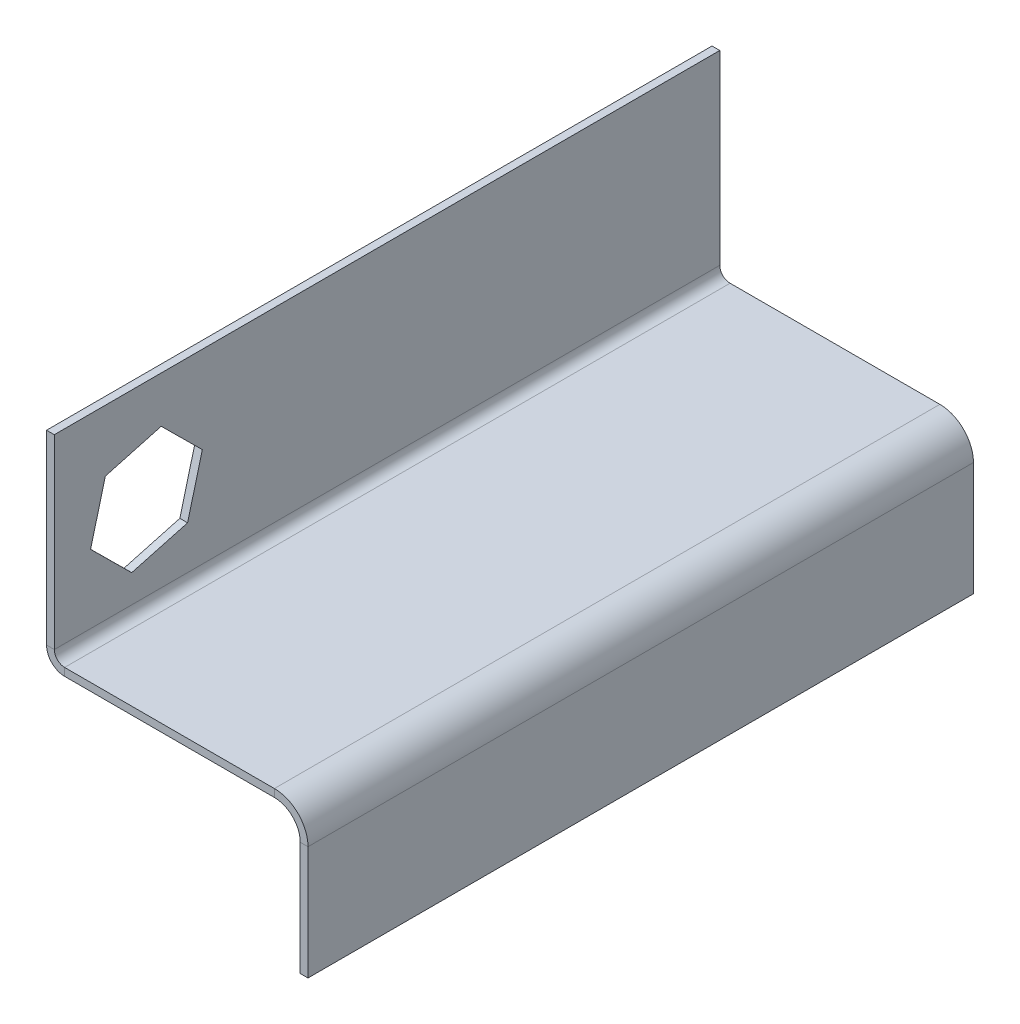
ISO-10303-21;
HEADER;
FILE_DESCRIPTION(('STEP AP214'),'2;1');
FILE_NAME('part.step','',(''),(''),'','','');
FILE_SCHEMA(('AUTOMOTIVE_DESIGN { 1 0 10303 214 1 1 1 1 }'));
ENDSEC;
DATA;
#1=APPLICATION_CONTEXT('core data for automotive mechanical design processes');
#2=APPLICATION_PROTOCOL_DEFINITION('international standard','automotive_design',2000,#1);
#3=PRODUCT_CONTEXT('',#1,'mechanical');
#4=PRODUCT('Part','Part','',(#3));
#5=PRODUCT_RELATED_PRODUCT_CATEGORY('part','',(#4));
#6=PRODUCT_DEFINITION_FORMATION('','',#4);
#7=PRODUCT_DEFINITION_CONTEXT('part definition',#1,'design');
#8=PRODUCT_DEFINITION('design','',#6,#7);
#9=PRODUCT_DEFINITION_SHAPE('','',#8);
#10=(LENGTH_UNIT() NAMED_UNIT(*) SI_UNIT(.MILLI.,.METRE.));
#11=(NAMED_UNIT(*) PLANE_ANGLE_UNIT() SI_UNIT($,.RADIAN.));
#12=(NAMED_UNIT(*) SI_UNIT($,.STERADIAN.) SOLID_ANGLE_UNIT());
#13=UNCERTAINTY_MEASURE_WITH_UNIT(LENGTH_MEASURE(1.E-05),#10,'distance_accuracy_value','');
#14=(GEOMETRIC_REPRESENTATION_CONTEXT(3) GLOBAL_UNCERTAINTY_ASSIGNED_CONTEXT((#13)) GLOBAL_UNIT_ASSIGNED_CONTEXT((#10,
#11,#12)) REPRESENTATION_CONTEXT('',''));
#15=CARTESIAN_POINT('',(0.,0.,0.));
#16=DIRECTION('',(0.,0.,1.));
#17=DIRECTION('',(1.,0.,0.));
#18=AXIS2_PLACEMENT_3D('',#15,#16,#17);
#19=CARTESIAN_POINT('',(-56.8403893475499,-26.7393226378745,257.539224291611));
#20=DIRECTION('',(0.,0.,1.));
#21=DIRECTION('',(1.,0.,0.));
#22=AXIS2_PLACEMENT_3D('',#19,#20,#21);
#23=PLANE('',#22);
#24=DIRECTION('',(1.,0.,0.));
#25=VECTOR('',#24,1.);
#26=CARTESIAN_POINT('',(-53.8403893475499,-33.7393226378745,257.539224291611));
#27=LINE('',#26,#25);
#28=CARTESIAN_POINT('',(-49.8403893475499,-33.7393226378745,257.539224291611));
#29=VERTEX_POINT('',#28);
#30=CARTESIAN_POINT('',(31.3391441685706,-33.7393226378745,257.539224291611));
#31=VERTEX_POINT('',#30);
#32=EDGE_CURVE('E280',#29,#31,#27,.T.);
#33=ORIENTED_EDGE('',*,*,#32,.T.);
#34=DIRECTION('',(0.,1.,0.));
#35=VECTOR('',#34,1.);
#36=CARTESIAN_POINT('',(31.3391441685706,-33.7393226378745,257.539224291611));
#37=LINE('',#36,#35);
#38=CARTESIAN_POINT('',(31.3391441685706,-30.7393226378745,257.539224291611));
#39=VERTEX_POINT('',#38);
#40=EDGE_CURVE('E242',#31,#39,#37,.T.);
#41=ORIENTED_EDGE('',*,*,#40,.T.);
#42=DIRECTION('',(1.,0.,0.));
#43=VECTOR('',#42,1.);
#44=CARTESIAN_POINT('',(-53.8403893475499,-30.7393226378745,257.539224291611));
#45=LINE('',#44,#43);
#46=CARTESIAN_POINT('',(-49.8403893475499,-30.7393226378745,257.539224291611));
#47=VERTEX_POINT('',#46);
#48=EDGE_CURVE('E283',#47,#39,#45,.T.);
#49=ORIENTED_EDGE('',*,*,#48,.F.);
#50=DIRECTION('',(0.,-1.,0.));
#51=VECTOR('',#50,1.);
#52=CARTESIAN_POINT('',(-49.8403893475499,-30.7393226378745,257.539224291611));
#53=LINE('',#52,#51);
#54=EDGE_CURVE('E343',#47,#29,#53,.T.);
#55=ORIENTED_EDGE('',*,*,#54,.T.);
#56=EDGE_LOOP('',(#33,#41,#49,#55));
#57=FACE_BOUND('',#56,.T.);
#58=ADVANCED_FACE('F60',(#57),#23,.T.);
#59=CARTESIAN_POINT('',(-53.8403893475499,-33.7393226378745,257.539224291611));
#60=DIRECTION('',(0.,1.,0.));
#61=DIRECTION('',(0.,0.,1.));
#62=AXIS2_PLACEMENT_3D('',#59,#60,#61);
#63=PLANE('',#62);
#64=DIRECTION('',(0.,0.,1.));
#65=VECTOR('',#64,1.);
#66=CARTESIAN_POINT('',(31.3391441685706,-33.7393226378745,257.539224291611));
#67=LINE('',#66,#65);
#68=CARTESIAN_POINT('',(31.3391441685706,-33.7393226378745,0.));
#69=VERTEX_POINT('',#68);
#70=EDGE_CURVE('E246',#31,#69,#67,.F.);
#71=ORIENTED_EDGE('',*,*,#70,.F.);
#72=ORIENTED_EDGE('',*,*,#32,.F.);
#73=DIRECTION('',(0.,0.,-1.));
#74=VECTOR('',#73,1.);
#75=CARTESIAN_POINT('',(-49.8403893475499,-33.7393226378745,257.539224291611));
#76=LINE('',#75,#74);
#77=CARTESIAN_POINT('',(-49.8403893475499,-33.7393226378745,0.));
#78=VERTEX_POINT('',#77);
#79=EDGE_CURVE('E302',#29,#78,#76,.T.);
#80=ORIENTED_EDGE('',*,*,#79,.T.);
#81=DIRECTION('',(1.,0.,0.));
#82=VECTOR('',#81,1.);
#83=CARTESIAN_POINT('',(-53.8403893475499,-33.7393226378745,0.));
#84=LINE('',#83,#82);
#85=EDGE_CURVE('E271',#78,#69,#84,.T.);
#86=ORIENTED_EDGE('',*,*,#85,.T.);
#87=EDGE_LOOP('',(#71,#72,#80,#86));
#88=FACE_BOUND('',#87,.T.);
#89=ADVANCED_FACE('F391',(#88),#63,.F.);
#90=CARTESIAN_POINT('',(-53.8403893475499,-30.7393226378745,257.539224291611));
#91=DIRECTION('',(0.,1.,0.));
#92=DIRECTION('',(0.,0.,1.));
#93=AXIS2_PLACEMENT_3D('',#90,#91,#92);
#94=PLANE('',#93);
#95=ORIENTED_EDGE('',*,*,#48,.T.);
#96=DIRECTION('',(0.,0.,1.));
#97=VECTOR('',#96,1.);
#98=CARTESIAN_POINT('',(31.3391441685706,-30.7393226378745,257.539224291611));
#99=LINE('',#98,#97);
#100=CARTESIAN_POINT('',(31.3391441685706,-30.7393226378745,0.));
#101=VERTEX_POINT('',#100);
#102=EDGE_CURVE('E192',#39,#101,#99,.F.);
#103=ORIENTED_EDGE('',*,*,#102,.T.);
#104=DIRECTION('',(1.,0.,0.));
#105=VECTOR('',#104,1.);
#106=CARTESIAN_POINT('',(-53.8403893475499,-30.7393226378745,0.));
#107=LINE('',#106,#105);
#108=CARTESIAN_POINT('',(-49.8403893475499,-30.7393226378745,0.));
#109=VERTEX_POINT('',#108);
#110=EDGE_CURVE('E305',#109,#101,#107,.T.);
#111=ORIENTED_EDGE('',*,*,#110,.F.);
#112=DIRECTION('',(0.,0.,-1.));
#113=VECTOR('',#112,1.);
#114=CARTESIAN_POINT('',(-49.8403893475499,-30.7393226378745,257.539224291611));
#115=LINE('',#114,#113);
#116=EDGE_CURVE('E334',#47,#109,#115,.T.);
#117=ORIENTED_EDGE('',*,*,#116,.F.);
#118=EDGE_LOOP('',(#95,#103,#111,#117));
#119=FACE_BOUND('',#118,.T.);
#120=ADVANCED_FACE('F396',(#119),#94,.T.);
#121=CARTESIAN_POINT('',(-49.8403893475499,-30.7393226378745,257.539224291611));
#122=DIRECTION('',(0.,0.,1.));
#123=DIRECTION('',(1.,0.,0.));
#124=AXIS2_PLACEMENT_3D('',#121,#122,#123);
#125=PLANE('',#124);
#126=ORIENTED_EDGE('',*,*,#54,.F.);
#127=CARTESIAN_POINT('',(-49.8403893475499,-26.7393226378745,257.539224291611));
#128=DIRECTION('',(0.,0.,-1.));
#129=DIRECTION('',(-1.,0.,0.));
#130=AXIS2_PLACEMENT_3D('',#127,#128,#129);
#131=CIRCLE('',#130,4.);
#132=CARTESIAN_POINT('',(-53.8403893475499,-26.7393226378745,257.539224291611));
#133=VERTEX_POINT('',#132);
#134=EDGE_CURVE('E287',#133,#47,#131,.F.);
#135=ORIENTED_EDGE('',*,*,#134,.F.);
#136=DIRECTION('',(1.,0.,0.));
#137=VECTOR('',#136,1.);
#138=CARTESIAN_POINT('',(-56.8403893475499,-26.7393226378745,257.539224291611));
#139=LINE('',#138,#137);
#140=CARTESIAN_POINT('',(-56.8403893475499,-26.7393226378745,257.539224291611));
#141=VERTEX_POINT('',#140);
#142=EDGE_CURVE('E341',#141,#133,#139,.T.);
#143=ORIENTED_EDGE('',*,*,#142,.F.);
#144=CARTESIAN_POINT('',(-49.8403893475499,-26.7393226378745,257.539224291611));
#145=DIRECTION('',(0.,0.,1.));
#146=DIRECTION('',(1.,0.,0.));
#147=AXIS2_PLACEMENT_3D('',#144,#145,#146);
#148=CIRCLE('',#147,7.);
#149=EDGE_CURVE('E299',#141,#29,#148,.T.);
#150=ORIENTED_EDGE('',*,*,#149,.T.);
#151=EDGE_LOOP('',(#126,#135,#143,#150));
#152=FACE_BOUND('',#151,.T.);
#153=ADVANCED_FACE('F62',(#152),#125,.T.);
#154=CARTESIAN_POINT('',(-53.8403893475499,-26.7393226378745,0.));
#155=DIRECTION('',(0.,0.,-1.));
#156=DIRECTION('',(-1.,0.,0.));
#157=AXIS2_PLACEMENT_3D('',#154,#155,#156);
#158=PLANE('',#157);
#159=DIRECTION('',(-1.,0.,0.));
#160=VECTOR('',#159,1.);
#161=CARTESIAN_POINT('',(-53.8403893475499,-26.7393226378745,0.));
#162=LINE('',#161,#160);
#163=CARTESIAN_POINT('',(-53.8403893475499,-26.7393226378745,0.));
#164=VERTEX_POINT('',#163);
#165=CARTESIAN_POINT('',(-56.8403893475499,-26.7393226378745,0.));
#166=VERTEX_POINT('',#165);
#167=EDGE_CURVE('E339',#164,#166,#162,.T.);
#168=ORIENTED_EDGE('',*,*,#167,.F.);
#169=CARTESIAN_POINT('',(-49.8403893475499,-26.7393226378745,0.));
#170=DIRECTION('',(0.,0.,-1.));
#171=DIRECTION('',(-1.,0.,0.));
#172=AXIS2_PLACEMENT_3D('',#169,#170,#171);
#173=CIRCLE('',#172,4.);
#174=EDGE_CURVE('E308',#164,#109,#173,.F.);
#175=ORIENTED_EDGE('',*,*,#174,.T.);
#176=DIRECTION('',(0.,1.,0.));
#177=VECTOR('',#176,1.);
#178=CARTESIAN_POINT('',(-49.8403893475499,-33.7393226378745,0.));
#179=LINE('',#178,#177);
#180=EDGE_CURVE('E337',#78,#109,#179,.T.);
#181=ORIENTED_EDGE('',*,*,#180,.F.);
#182=CARTESIAN_POINT('',(-49.8403893475499,-26.7393226378745,0.));
#183=DIRECTION('',(0.,0.,1.));
#184=DIRECTION('',(1.,0.,0.));
#185=AXIS2_PLACEMENT_3D('',#182,#183,#184);
#186=CIRCLE('',#185,7.);
#187=EDGE_CURVE('E284',#166,#78,#186,.T.);
#188=ORIENTED_EDGE('',*,*,#187,.F.);
#189=EDGE_LOOP('',(#168,#175,#181,#188));
#190=FACE_BOUND('',#189,.T.);
#191=ADVANCED_FACE('F400',(#190),#158,.T.);
#192=CARTESIAN_POINT('',(-49.8403893475499,-33.7393226378745,0.));
#193=DIRECTION('',(0.,0.,-1.));
#194=DIRECTION('',(-1.,0.,0.));
#195=AXIS2_PLACEMENT_3D('',#192,#193,#194);
#196=PLANE('',#195);
#197=DIRECTION('',(0.,-1.,0.));
#198=VECTOR('',#197,1.);
#199=CARTESIAN_POINT('',(-53.8403893475499,45.2706387939607,0.));
#200=LINE('',#199,#198);
#201=CARTESIAN_POINT('',(-53.8403893475499,45.2706387939607,0.));
#202=VERTEX_POINT('',#201);
#203=EDGE_CURVE('E311',#202,#164,#200,.T.);
#204=ORIENTED_EDGE('',*,*,#203,.T.);
#205=ORIENTED_EDGE('',*,*,#167,.T.);
#206=DIRECTION('',(0.,1.,0.));
#207=VECTOR('',#206,1.);
#208=CARTESIAN_POINT('',(-56.8403893475499,45.2706387939607,0.));
#209=LINE('',#208,#207);
#210=CARTESIAN_POINT('',(-56.8403893475499,45.2706387939607,0.));
#211=VERTEX_POINT('',#210);
#212=EDGE_CURVE('E317',#211,#166,#209,.F.);
#213=ORIENTED_EDGE('',*,*,#212,.F.);
#214=DIRECTION('',(1.,0.,0.));
#215=VECTOR('',#214,1.);
#216=CARTESIAN_POINT('',(-56.8403893475499,45.2706387939607,0.));
#217=LINE('',#216,#215);
#218=EDGE_CURVE('E314',#211,#202,#217,.T.);
#219=ORIENTED_EDGE('',*,*,#218,.T.);
#220=EDGE_LOOP('',(#204,#205,#213,#219));
#221=FACE_BOUND('',#220,.T.);
#222=ADVANCED_FACE('F403',(#221),#196,.T.);
#223=CARTESIAN_POINT('',(-49.8403893475499,-26.7393226378745,257.539224291611));
#224=DIRECTION('',(0.,0.,-1.));
#225=DIRECTION('',(-1.,0.,0.));
#226=AXIS2_PLACEMENT_3D('',#223,#224,#225);
#227=CYLINDRICAL_SURFACE('',#226,4.);
#228=ORIENTED_EDGE('',*,*,#174,.F.);
#229=DIRECTION('',(0.,0.,-1.));
#230=VECTOR('',#229,1.);
#231=CARTESIAN_POINT('',(-53.8403893475499,-26.7393226378745,257.539224291611));
#232=LINE('',#231,#230);
#233=EDGE_CURVE('E331',#133,#164,#232,.T.);
#234=ORIENTED_EDGE('',*,*,#233,.F.);
#235=ORIENTED_EDGE('',*,*,#134,.T.);
#236=ORIENTED_EDGE('',*,*,#116,.T.);
#237=EDGE_LOOP('',(#228,#234,#235,#236));
#238=FACE_BOUND('',#237,.T.);
#239=ADVANCED_FACE('F406',(#238),#227,.F.);
#240=CARTESIAN_POINT('',(-53.8403893475499,45.2706387939607,257.539224291611));
#241=DIRECTION('',(1.,0.,0.));
#242=DIRECTION('',(0.,0.,-1.));
#243=AXIS2_PLACEMENT_3D('',#240,#241,#242);
#244=PLANE('',#243);
#245=DIRECTION('',(0.,0.704077392377449,0.710123246727616));
#246=VECTOR('',#245,1.);
#247=CARTESIAN_POINT('',(-53.8403893475499,11.6094138400761,200.245910723487));
#248=LINE('',#247,#246);
#249=CARTESIAN_POINT('',(-53.8403893475499,11.6094138400761,200.245910723487));
#250=VERTEX_POINT('',#249);
#251=CARTESIAN_POINT('',(-53.8403893475499,27.3905891493059,216.162597680196));
#252=VERTEX_POINT('',#251);
#253=EDGE_CURVE('E75',#250,#252,#248,.T.);
#254=ORIENTED_EDGE('',*,*,#253,.F.);
#255=DIRECTION('',(0.,0.967023467672726,-0.254687284665366));
#256=VECTOR('',#255,1.);
#257=CARTESIAN_POINT('',(-53.8403893475499,-10.0654290631334,205.954465964501));
#258=LINE('',#257,#256);
#259=CARTESIAN_POINT('',(-53.8403893475499,-10.0654290631334,205.954465964501));
#260=VERTEX_POINT('',#259);
#261=EDGE_CURVE('E265',#260,#250,#258,.T.);
#262=ORIENTED_EDGE('',*,*,#261,.F.);
#263=DIRECTION('',(0.,0.262946075295278,-0.964810531392983));
#264=VECTOR('',#263,1.);
#265=CARTESIAN_POINT('',(-53.8403893475499,-15.9590966571131,227.579708162224));
#266=LINE('',#265,#264);
#267=CARTESIAN_POINT('',(-53.8403893475499,-15.9590966571131,227.579708162224));
#268=VERTEX_POINT('',#267);
#269=EDGE_CURVE('E262',#268,#260,#266,.T.);
#270=ORIENTED_EDGE('',*,*,#269,.F.);
#271=DIRECTION('',(0.,-0.704077392377448,-0.710123246727617));
#272=VECTOR('',#271,1.);
#273=CARTESIAN_POINT('',(-53.8403893475499,-0.177921347883333,243.496395118933));
#274=LINE('',#273,#272);
#275=CARTESIAN_POINT('',(-53.8403893475499,-0.177921347883333,243.496395118933));
#276=VERTEX_POINT('',#275);
#277=EDGE_CURVE('E259',#276,#268,#274,.T.);
#278=ORIENTED_EDGE('',*,*,#277,.F.);
#279=DIRECTION('',(0.,-0.967023467672726,0.254687284665365));
#280=VECTOR('',#279,1.);
#281=CARTESIAN_POINT('',(-53.8403893475499,21.4969215553262,237.787839877919));
#282=LINE('',#281,#280);
#283=CARTESIAN_POINT('',(-53.8403893475499,21.4969215553262,237.787839877919));
#284=VERTEX_POINT('',#283);
#285=EDGE_CURVE('E256',#284,#276,#282,.T.);
#286=ORIENTED_EDGE('',*,*,#285,.F.);
#287=DIRECTION('',(0.,-0.262946075295276,0.964810531392983));
#288=VECTOR('',#287,1.);
#289=CARTESIAN_POINT('',(-53.8403893475499,27.3905891493059,216.162597680196));
#290=LINE('',#289,#288);
#291=EDGE_CURVE('E254',#252,#284,#290,.T.);
#292=ORIENTED_EDGE('',*,*,#291,.F.);
#293=EDGE_LOOP('',(#254,#262,#270,#278,#286,#292));
#294=FACE_BOUND('',#293,.T.);
#295=ORIENTED_EDGE('',*,*,#203,.F.);
#296=DIRECTION('',(0.,0.,-1.));
#297=VECTOR('',#296,1.);
#298=CARTESIAN_POINT('',(-53.8403893475499,45.2706387939607,257.539224291611));
#299=LINE('',#298,#297);
#300=CARTESIAN_POINT('',(-53.8403893475499,45.2706387939607,257.539224291611));
#301=VERTEX_POINT('',#300);
#302=EDGE_CURVE('E329',#301,#202,#299,.T.);
#303=ORIENTED_EDGE('',*,*,#302,.F.);
#304=DIRECTION('',(0.,-1.,0.));
#305=VECTOR('',#304,1.);
#306=CARTESIAN_POINT('',(-53.8403893475499,45.2706387939607,257.539224291611));
#307=LINE('',#306,#305);
#308=EDGE_CURVE('E290',#301,#133,#307,.T.);
#309=ORIENTED_EDGE('',*,*,#308,.T.);
#310=ORIENTED_EDGE('',*,*,#233,.T.);
#311=EDGE_LOOP('',(#295,#303,#309,#310));
#312=FACE_BOUND('',#311,.T.);
#313=ADVANCED_FACE('F371',(#294,#312),#244,.T.);
#314=CARTESIAN_POINT('',(-56.8403893475499,45.2706387939607,257.539224291611));
#315=DIRECTION('',(0.,1.,0.));
#316=DIRECTION('',(0.,0.,1.));
#317=AXIS2_PLACEMENT_3D('',#314,#315,#316);
#318=PLANE('',#317);
#319=ORIENTED_EDGE('',*,*,#218,.F.);
#320=DIRECTION('',(0.,0.,-1.));
#321=VECTOR('',#320,1.);
#322=CARTESIAN_POINT('',(-56.8403893475499,45.2706387939607,257.539224291611));
#323=LINE('',#322,#321);
#324=CARTESIAN_POINT('',(-56.8403893475499,45.2706387939607,257.539224291611));
#325=VERTEX_POINT('',#324);
#326=EDGE_CURVE('E327',#325,#211,#323,.T.);
#327=ORIENTED_EDGE('',*,*,#326,.F.);
#328=DIRECTION('',(1.,0.,0.));
#329=VECTOR('',#328,1.);
#330=CARTESIAN_POINT('',(-56.8403893475499,45.2706387939607,257.539224291611));
#331=LINE('',#330,#329);
#332=EDGE_CURVE('E293',#325,#301,#331,.T.);
#333=ORIENTED_EDGE('',*,*,#332,.T.);
#334=ORIENTED_EDGE('',*,*,#302,.T.);
#335=EDGE_LOOP('',(#319,#327,#333,#334));
#336=FACE_BOUND('',#335,.T.);
#337=ADVANCED_FACE('F417',(#336),#318,.T.);
#338=CARTESIAN_POINT('',(-56.8403893475499,45.2706387939607,257.539224291611));
#339=DIRECTION('',(1.,0.,0.));
#340=DIRECTION('',(0.,0.,-1.));
#341=AXIS2_PLACEMENT_3D('',#338,#339,#340);
#342=PLANE('',#341);
#343=DIRECTION('',(0.,0.967023467672726,-0.254687284665366));
#344=VECTOR('',#343,1.);
#345=CARTESIAN_POINT('',(-56.8403893475499,28.9764938936743,195.671901292193));
#346=LINE('',#345,#344);
#347=CARTESIAN_POINT('',(-56.8403893475499,-10.0654290631334,205.954465964501));
#348=VERTEX_POINT('',#347);
#349=CARTESIAN_POINT('',(-56.8403893475499,11.6094138400761,200.245910723487));
#350=VERTEX_POINT('',#349);
#351=EDGE_CURVE('E68',#348,#350,#346,.T.);
#352=ORIENTED_EDGE('',*,*,#351,.T.);
#353=DIRECTION('',(0.,0.70407739237745,0.710123246727616));
#354=VECTOR('',#353,1.);
#355=CARTESIAN_POINT('',(-56.8403893475499,56.9417334018317,245.967495164917));
#356=LINE('',#355,#354);
#357=CARTESIAN_POINT('',(-56.8403893475499,27.3905891493059,216.162597680196));
#358=VERTEX_POINT('',#357);
#359=EDGE_CURVE('E13',#350,#358,#356,.T.);
#360=ORIENTED_EDGE('',*,*,#359,.T.);
#361=DIRECTION('',(0.,-0.262946075295276,0.964810531392984));
#362=VECTOR('',#361,1.);
#363=CARTESIAN_POINT('',(-56.8403893475499,18.1298607617689,250.142371923383));
#364=LINE('',#363,#362);
#365=CARTESIAN_POINT('',(-56.8403893475499,21.4969215553262,237.787839877919));
#366=VERTEX_POINT('',#365);
#367=EDGE_CURVE('E345',#358,#366,#364,.T.);
#368=ORIENTED_EDGE('',*,*,#367,.T.);
#369=DIRECTION('',(0.,-0.967023467672726,0.254687284665365));
#370=VECTOR('',#369,1.);
#371=CARTESIAN_POINT('',(-56.8403893475499,38.8640016089244,233.213830446626));
#372=LINE('',#371,#370);
#373=CARTESIAN_POINT('',(-56.8403893475499,-0.177921347883333,243.496395118933));
#374=VERTEX_POINT('',#373);
#375=EDGE_CURVE('E348',#366,#374,#372,.T.);
#376=ORIENTED_EDGE('',*,*,#375,.T.);
#377=DIRECTION('',(0.,-0.704077392377448,-0.710123246727618));
#378=VECTOR('',#377,1.);
#379=CARTESIAN_POINT('',(-56.8403893475499,29.3732229046424,273.301292603655));
#380=LINE('',#379,#378);
#381=CARTESIAN_POINT('',(-56.8403893475499,-15.9590966571131,227.579708162224));
#382=VERTEX_POINT('',#381);
#383=EDGE_CURVE('E351',#374,#382,#380,.T.);
#384=ORIENTED_EDGE('',*,*,#383,.T.);
#385=DIRECTION('',(0.,0.262946075295278,-0.964810531392983));
#386=VECTOR('',#385,1.);
#387=CARTESIAN_POINT('',(-56.8403893475499,-19.3261574506705,239.934240207688));
#388=LINE('',#387,#386);
#389=EDGE_CURVE('E354',#382,#348,#388,.T.);
#390=ORIENTED_EDGE('',*,*,#389,.T.);
#391=EDGE_LOOP('',(#352,#360,#368,#376,#384,#390));
#392=FACE_BOUND('',#391,.T.);
#393=ORIENTED_EDGE('',*,*,#212,.T.);
#394=DIRECTION('',(0.,0.,-1.));
#395=VECTOR('',#394,1.);
#396=CARTESIAN_POINT('',(-56.8403893475499,-26.7393226378745,257.539224291611));
#397=LINE('',#396,#395);
#398=EDGE_CURVE('E324',#141,#166,#397,.T.);
#399=ORIENTED_EDGE('',*,*,#398,.F.);
#400=DIRECTION('',(0.,1.,0.));
#401=VECTOR('',#400,1.);
#402=CARTESIAN_POINT('',(-56.8403893475499,45.2706387939607,257.539224291611));
#403=LINE('',#402,#401);
#404=EDGE_CURVE('E296',#325,#141,#403,.F.);
#405=ORIENTED_EDGE('',*,*,#404,.F.);
#406=ORIENTED_EDGE('',*,*,#326,.T.);
#407=EDGE_LOOP('',(#393,#399,#405,#406));
#408=FACE_BOUND('',#407,.T.);
#409=ADVANCED_FACE('F358',(#392,#408),#342,.F.);
#410=CARTESIAN_POINT('',(-49.8403893475499,-26.7393226378745,257.539224291611));
#411=DIRECTION('',(0.,0.,-1.));
#412=DIRECTION('',(-1.,0.,0.));
#413=AXIS2_PLACEMENT_3D('',#410,#411,#412);
#414=CYLINDRICAL_SURFACE('',#413,7.);
#415=ORIENTED_EDGE('',*,*,#187,.T.);
#416=ORIENTED_EDGE('',*,*,#79,.F.);
#417=ORIENTED_EDGE('',*,*,#149,.F.);
#418=ORIENTED_EDGE('',*,*,#398,.T.);
#419=EDGE_LOOP('',(#415,#416,#417,#418));
#420=FACE_BOUND('',#419,.T.);
#421=ADVANCED_FACE('F423',(#420),#414,.T.);
#422=CARTESIAN_POINT('',(-49.8403893475499,-26.7393226378745,257.539224291611));
#423=DIRECTION('',(0.,0.,-1.));
#424=DIRECTION('',(-1.,0.,0.));
#425=AXIS2_PLACEMENT_3D('',#422,#423,#424);
#426=PLANE('',#425);
#427=ORIENTED_EDGE('',*,*,#404,.T.);
#428=ORIENTED_EDGE('',*,*,#142,.T.);
#429=ORIENTED_EDGE('',*,*,#308,.F.);
#430=ORIENTED_EDGE('',*,*,#332,.F.);
#431=EDGE_LOOP('',(#427,#428,#429,#430));
#432=FACE_BOUND('',#431,.T.);
#433=ADVANCED_FACE('F385',(#432),#426,.F.);
#434=CARTESIAN_POINT('',(-49.8403893475499,-26.7393226378745,0.));
#435=DIRECTION('',(0.,0.,-1.));
#436=DIRECTION('',(-1.,0.,0.));
#437=AXIS2_PLACEMENT_3D('',#434,#435,#436);
#438=PLANE('',#437);
#439=DIRECTION('',(0.,1.,0.));
#440=VECTOR('',#439,1.);
#441=CARTESIAN_POINT('',(31.3391441685706,-33.7393226378745,0.));
#442=LINE('',#441,#440);
#443=EDGE_CURVE('E249',#69,#101,#442,.T.);
#444=ORIENTED_EDGE('',*,*,#443,.F.);
#445=ORIENTED_EDGE('',*,*,#85,.F.);
#446=ORIENTED_EDGE('',*,*,#180,.T.);
#447=ORIENTED_EDGE('',*,*,#110,.T.);
#448=EDGE_LOOP('',(#444,#445,#446,#447));
#449=FACE_BOUND('',#448,.T.);
#450=ADVANCED_FACE('F378',(#449),#438,.T.);
#451=CARTESIAN_POINT('',(-63.8403893475499,11.6094138400761,200.245910723487));
#452=DIRECTION('',(0.,0.710123246727616,-0.704077392377449));
#453=DIRECTION('',(0.,0.70407739237745,0.710123246727616));
#454=AXIS2_PLACEMENT_3D('',#451,#452,#453);
#455=PLANE('',#454);
#456=DIRECTION('',(1.,0.,0.));
#457=VECTOR('',#456,1.);
#458=CARTESIAN_POINT('',(-63.8403893475499,11.6094138400761,200.245910723487));
#459=LINE('',#458,#457);
#460=EDGE_CURVE('E269',#350,#250,#459,.T.);
#461=ORIENTED_EDGE('',*,*,#460,.T.);
#462=ORIENTED_EDGE('',*,*,#253,.T.);
#463=DIRECTION('',(1.,0.,0.));
#464=VECTOR('',#463,1.);
#465=CARTESIAN_POINT('',(-63.8403893475499,27.3905891493059,216.162597680196));
#466=LINE('',#465,#464);
#467=EDGE_CURVE('E268',#358,#252,#466,.T.);
#468=ORIENTED_EDGE('',*,*,#467,.F.);
#469=ORIENTED_EDGE('',*,*,#359,.F.);
#470=EDGE_LOOP('',(#461,#462,#468,#469));
#471=FACE_BOUND('',#470,.T.);
#472=ADVANCED_FACE('F376',(#471),#455,.F.);
#473=CARTESIAN_POINT('',(-63.8403893475499,-10.0654290631334,205.954465964501));
#474=DIRECTION('',(0.,-0.254687284665366,-0.967023467672726));
#475=DIRECTION('',(0.,0.967023467672726,-0.254687284665366));
#476=AXIS2_PLACEMENT_3D('',#473,#474,#475);
#477=PLANE('',#476);
#478=DIRECTION('',(1.,0.,0.));
#479=VECTOR('',#478,1.);
#480=CARTESIAN_POINT('',(-63.8403893475499,-10.0654290631334,205.954465964501));
#481=LINE('',#480,#479);
#482=EDGE_CURVE('E272',#348,#260,#481,.T.);
#483=ORIENTED_EDGE('',*,*,#482,.T.);
#484=ORIENTED_EDGE('',*,*,#261,.T.);
#485=ORIENTED_EDGE('',*,*,#460,.F.);
#486=ORIENTED_EDGE('',*,*,#351,.F.);
#487=EDGE_LOOP('',(#483,#484,#485,#486));
#488=FACE_BOUND('',#487,.T.);
#489=ADVANCED_FACE('F363',(#488),#477,.F.);
#490=CARTESIAN_POINT('',(-63.8403893475499,-15.9590966571131,227.579708162224));
#491=DIRECTION('',(0.,-0.964810531392983,-0.262946075295278));
#492=DIRECTION('',(0.,0.262946075295278,-0.964810531392983));
#493=AXIS2_PLACEMENT_3D('',#490,#491,#492);
#494=PLANE('',#493);
#495=DIRECTION('',(1.,0.,0.));
#496=VECTOR('',#495,1.);
#497=CARTESIAN_POINT('',(-63.8403893475499,-15.9590966571131,227.579708162224));
#498=LINE('',#497,#496);
#499=EDGE_CURVE('E274',#382,#268,#498,.T.);
#500=ORIENTED_EDGE('',*,*,#499,.T.);
#501=ORIENTED_EDGE('',*,*,#269,.T.);
#502=ORIENTED_EDGE('',*,*,#482,.F.);
#503=ORIENTED_EDGE('',*,*,#389,.F.);
#504=EDGE_LOOP('',(#500,#501,#502,#503));
#505=FACE_BOUND('',#504,.T.);
#506=ADVANCED_FACE('F365',(#505),#494,.F.);
#507=CARTESIAN_POINT('',(-63.8403893475499,-0.177921347883333,243.496395118933));
#508=DIRECTION('',(0.,-0.710123246727618,0.704077392377448));
#509=DIRECTION('',(0.,-0.704077392377448,-0.710123246727618));
#510=AXIS2_PLACEMENT_3D('',#507,#508,#509);
#511=PLANE('',#510);
#512=DIRECTION('',(1.,0.,0.));
#513=VECTOR('',#512,1.);
#514=CARTESIAN_POINT('',(-63.8403893475499,-0.177921347883333,243.496395118933));
#515=LINE('',#514,#513);
#516=EDGE_CURVE('E276',#374,#276,#515,.T.);
#517=ORIENTED_EDGE('',*,*,#516,.T.);
#518=ORIENTED_EDGE('',*,*,#277,.T.);
#519=ORIENTED_EDGE('',*,*,#499,.F.);
#520=ORIENTED_EDGE('',*,*,#383,.F.);
#521=EDGE_LOOP('',(#517,#518,#519,#520));
#522=FACE_BOUND('',#521,.T.);
#523=ADVANCED_FACE('F485',(#522),#511,.F.);
#524=CARTESIAN_POINT('',(-63.8403893475499,21.4969215553262,237.787839877919));
#525=DIRECTION('',(0.,0.254687284665365,0.967023467672726));
#526=DIRECTION('',(0.,-0.967023467672726,0.254687284665365));
#527=AXIS2_PLACEMENT_3D('',#524,#525,#526);
#528=PLANE('',#527);
#529=DIRECTION('',(1.,0.,0.));
#530=VECTOR('',#529,1.);
#531=CARTESIAN_POINT('',(-63.8403893475499,21.4969215553262,237.787839877919));
#532=LINE('',#531,#530);
#533=EDGE_CURVE('E83',#366,#284,#532,.T.);
#534=ORIENTED_EDGE('',*,*,#533,.T.);
#535=ORIENTED_EDGE('',*,*,#285,.T.);
#536=ORIENTED_EDGE('',*,*,#516,.F.);
#537=ORIENTED_EDGE('',*,*,#375,.F.);
#538=EDGE_LOOP('',(#534,#535,#536,#537));
#539=FACE_BOUND('',#538,.T.);
#540=ADVANCED_FACE('F488',(#539),#528,.F.);
#541=CARTESIAN_POINT('',(-63.8403893475499,27.3905891493059,216.162597680196));
#542=DIRECTION('',(0.,0.964810531392984,0.262946075295276));
#543=DIRECTION('',(0.,-0.262946075295276,0.964810531392984));
#544=AXIS2_PLACEMENT_3D('',#541,#542,#543);
#545=PLANE('',#544);
#546=ORIENTED_EDGE('',*,*,#467,.T.);
#547=ORIENTED_EDGE('',*,*,#291,.T.);
#548=ORIENTED_EDGE('',*,*,#533,.F.);
#549=ORIENTED_EDGE('',*,*,#367,.F.);
#550=EDGE_LOOP('',(#546,#547,#548,#549));
#551=FACE_BOUND('',#550,.T.);
#552=ADVANCED_FACE('F375',(#551),#545,.F.);
#553=CARTESIAN_POINT('',(31.3391441685706,-43.7393226378745,0.));
#554=DIRECTION('',(0.,0.,-1.));
#555=DIRECTION('',(-1.,0.,0.));
#556=AXIS2_PLACEMENT_3D('',#553,#554,#555);
#557=PLANE('',#556);
#558=DIRECTION('',(1.,0.,0.));
#559=VECTOR('',#558,1.);
#560=CARTESIAN_POINT('',(44.3391441685706,-43.7393226378745,0.));
#561=LINE('',#560,#559);
#562=CARTESIAN_POINT('',(41.3391441685706,-43.7393226378745,0.));
#563=VERTEX_POINT('',#562);
#564=CARTESIAN_POINT('',(44.3391441685706,-43.7393226378745,0.));
#565=VERTEX_POINT('',#564);
#566=EDGE_CURVE('E237',#563,#565,#561,.T.);
#567=ORIENTED_EDGE('',*,*,#566,.F.);
#568=CARTESIAN_POINT('',(31.3391441685706,-43.7393226378745,0.));
#569=DIRECTION('',(0.,0.,1.));
#570=DIRECTION('',(1.,0.,0.));
#571=AXIS2_PLACEMENT_3D('',#568,#569,#570);
#572=CIRCLE('',#571,10.);
#573=EDGE_CURVE('E195',#69,#563,#572,.F.);
#574=ORIENTED_EDGE('',*,*,#573,.F.);
#575=ORIENTED_EDGE('',*,*,#443,.T.);
#576=CARTESIAN_POINT('',(31.3391441685706,-43.7393226378745,0.));
#577=DIRECTION('',(0.,0.,1.));
#578=DIRECTION('',(1.,0.,0.));
#579=AXIS2_PLACEMENT_3D('',#576,#577,#578);
#580=CIRCLE('',#579,13.);
#581=EDGE_CURVE('E241',#101,#565,#580,.F.);
#582=ORIENTED_EDGE('',*,*,#581,.T.);
#583=EDGE_LOOP('',(#567,#574,#575,#582));
#584=FACE_BOUND('',#583,.T.);
#585=ADVANCED_FACE('F452',(#584),#557,.T.);
#586=CARTESIAN_POINT('',(31.3391441685706,-43.7393226378745,257.539224291611));
#587=DIRECTION('',(0.,0.,-1.));
#588=DIRECTION('',(-1.,0.,0.));
#589=AXIS2_PLACEMENT_3D('',#586,#587,#588);
#590=PLANE('',#589);
#591=CARTESIAN_POINT('',(31.3391441685706,-43.7393226378745,257.539224291611));
#592=DIRECTION('',(0.,0.,1.));
#593=DIRECTION('',(1.,0.,0.));
#594=AXIS2_PLACEMENT_3D('',#591,#592,#593);
#595=CIRCLE('',#594,10.);
#596=CARTESIAN_POINT('',(41.3391441685706,-43.7393226378745,257.539224291611));
#597=VERTEX_POINT('',#596);
#598=EDGE_CURVE('E202',#597,#31,#595,.T.);
#599=ORIENTED_EDGE('',*,*,#598,.F.);
#600=DIRECTION('',(1.,0.,0.));
#601=VECTOR('',#600,1.);
#602=CARTESIAN_POINT('',(41.3391441685706,-43.7393226378745,257.539224291611));
#603=LINE('',#602,#601);
#604=CARTESIAN_POINT('',(44.3391441685706,-43.7393226378745,257.539224291611));
#605=VERTEX_POINT('',#604);
#606=EDGE_CURVE('E199',#597,#605,#603,.T.);
#607=ORIENTED_EDGE('',*,*,#606,.T.);
#608=CARTESIAN_POINT('',(31.3391441685706,-43.7393226378745,257.539224291611));
#609=DIRECTION('',(0.,0.,1.));
#610=DIRECTION('',(1.,0.,0.));
#611=AXIS2_PLACEMENT_3D('',#608,#609,#610);
#612=CIRCLE('',#611,13.);
#613=EDGE_CURVE('E185',#605,#39,#612,.T.);
#614=ORIENTED_EDGE('',*,*,#613,.T.);
#615=ORIENTED_EDGE('',*,*,#40,.F.);
#616=EDGE_LOOP('',(#599,#607,#614,#615));
#617=FACE_BOUND('',#616,.T.);
#618=ADVANCED_FACE('F200',(#617),#590,.F.);
#619=CARTESIAN_POINT('',(31.3391441685706,-43.7393226378745,257.539224291611));
#620=DIRECTION('',(0.,0.,1.));
#621=DIRECTION('',(1.,0.,0.));
#622=AXIS2_PLACEMENT_3D('',#619,#620,#621);
#623=CYLINDRICAL_SURFACE('',#622,13.);
#624=ORIENTED_EDGE('',*,*,#102,.F.);
#625=ORIENTED_EDGE('',*,*,#613,.F.);
#626=DIRECTION('',(0.,0.,1.));
#627=VECTOR('',#626,1.);
#628=CARTESIAN_POINT('',(44.3391441685706,-43.7393226378745,0.));
#629=LINE('',#628,#627);
#630=EDGE_CURVE('E189',#565,#605,#629,.T.);
#631=ORIENTED_EDGE('',*,*,#630,.F.);
#632=ORIENTED_EDGE('',*,*,#581,.F.);
#633=EDGE_LOOP('',(#624,#625,#631,#632));
#634=FACE_BOUND('',#633,.T.);
#635=ADVANCED_FACE('F187',(#634),#623,.T.);
#636=CARTESIAN_POINT('',(31.3391441685706,-43.7393226378745,257.539224291611));
#637=DIRECTION('',(0.,0.,1.));
#638=DIRECTION('',(1.,0.,0.));
#639=AXIS2_PLACEMENT_3D('',#636,#637,#638);
#640=CYLINDRICAL_SURFACE('',#639,10.);
#641=ORIENTED_EDGE('',*,*,#70,.T.);
#642=ORIENTED_EDGE('',*,*,#573,.T.);
#643=DIRECTION('',(0.,0.,-1.));
#644=VECTOR('',#643,1.);
#645=CARTESIAN_POINT('',(41.3391441685706,-43.7393226378745,0.));
#646=LINE('',#645,#644);
#647=EDGE_CURVE('E207',#563,#597,#646,.F.);
#648=ORIENTED_EDGE('',*,*,#647,.T.);
#649=ORIENTED_EDGE('',*,*,#598,.T.);
#650=EDGE_LOOP('',(#641,#642,#648,#649));
#651=FACE_BOUND('',#650,.T.);
#652=ADVANCED_FACE('F455',(#651),#640,.F.);
#653=CARTESIAN_POINT('',(44.3391441685705,-33.7393226378745,257.539224291611));
#654=DIRECTION('',(0.,0.,1.));
#655=DIRECTION('',(1.,0.,0.));
#656=AXIS2_PLACEMENT_3D('',#653,#654,#655);
#657=PLANE('',#656);
#658=DIRECTION('',(0.,1.,0.));
#659=VECTOR('',#658,1.);
#660=CARTESIAN_POINT('',(44.3391441685705,-33.7393226378745,257.539224291611));
#661=LINE('',#660,#659);
#662=CARTESIAN_POINT('',(44.3391441685707,-87.7393226378745,257.539224291611));
#663=VERTEX_POINT('',#662);
#664=EDGE_CURVE('E214',#663,#605,#661,.T.);
#665=ORIENTED_EDGE('',*,*,#664,.T.);
#666=ORIENTED_EDGE('',*,*,#606,.F.);
#667=DIRECTION('',(0.,-1.,0.));
#668=VECTOR('',#667,1.);
#669=CARTESIAN_POINT('',(41.3391441685704,1.53832308587879E-13,257.539224291611));
#670=LINE('',#669,#668);
#671=CARTESIAN_POINT('',(41.3391441685707,-87.7393226378745,257.539224291611));
#672=VERTEX_POINT('',#671);
#673=EDGE_CURVE('E230',#672,#597,#670,.F.);
#674=ORIENTED_EDGE('',*,*,#673,.F.);
#675=DIRECTION('',(-1.,0.,0.));
#676=VECTOR('',#675,1.);
#677=CARTESIAN_POINT('',(44.3391441685707,-87.7393226378745,257.539224291611));
#678=LINE('',#677,#676);
#679=EDGE_CURVE('E219',#663,#672,#678,.T.);
#680=ORIENTED_EDGE('',*,*,#679,.F.);
#681=EDGE_LOOP('',(#665,#666,#674,#680));
#682=FACE_BOUND('',#681,.T.);
#683=ADVANCED_FACE('F218',(#682),#657,.T.);
#684=CARTESIAN_POINT('',(44.3391441685707,-87.7393226378745,0.));
#685=DIRECTION('',(0.,0.,-1.));
#686=DIRECTION('',(-1.,0.,0.));
#687=AXIS2_PLACEMENT_3D('',#684,#685,#686);
#688=PLANE('',#687);
#689=DIRECTION('',(0.,1.,0.));
#690=VECTOR('',#689,1.);
#691=CARTESIAN_POINT('',(41.3391441685704,1.53832308587879E-13,0.));
#692=LINE('',#691,#690);
#693=CARTESIAN_POINT('',(41.3391441685707,-87.7393226378745,0.));
#694=VERTEX_POINT('',#693);
#695=EDGE_CURVE('E216',#563,#694,#692,.F.);
#696=ORIENTED_EDGE('',*,*,#695,.F.);
#697=ORIENTED_EDGE('',*,*,#566,.T.);
#698=DIRECTION('',(0.,-1.,0.));
#699=VECTOR('',#698,1.);
#700=CARTESIAN_POINT('',(44.3391441685707,-87.7393226378745,0.));
#701=LINE('',#700,#699);
#702=CARTESIAN_POINT('',(44.3391441685707,-87.7393226378745,0.));
#703=VERTEX_POINT('',#702);
#704=EDGE_CURVE('E215',#565,#703,#701,.T.);
#705=ORIENTED_EDGE('',*,*,#704,.T.);
#706=DIRECTION('',(-1.,0.,0.));
#707=VECTOR('',#706,1.);
#708=CARTESIAN_POINT('',(44.3391441685707,-87.7393226378745,0.));
#709=LINE('',#708,#707);
#710=EDGE_CURVE('E221',#703,#694,#709,.T.);
#711=ORIENTED_EDGE('',*,*,#710,.T.);
#712=EDGE_LOOP('',(#696,#697,#705,#711));
#713=FACE_BOUND('',#712,.T.);
#714=ADVANCED_FACE('F460',(#713),#688,.T.);
#715=CARTESIAN_POINT('',(44.3391441685704,1.64306752604408E-13,0.));
#716=DIRECTION('',(1.,0.,0.));
#717=DIRECTION('',(0.,1.,0.));
#718=AXIS2_PLACEMENT_3D('',#715,#716,#717);
#719=PLANE('',#718);
#720=ORIENTED_EDGE('',*,*,#704,.F.);
#721=ORIENTED_EDGE('',*,*,#630,.T.);
#722=ORIENTED_EDGE('',*,*,#664,.F.);
#723=DIRECTION('',(0.,0.,1.));
#724=VECTOR('',#723,1.);
#725=CARTESIAN_POINT('',(44.3391441685707,-87.7393226378745,257.539224291611));
#726=LINE('',#725,#724);
#727=EDGE_CURVE('E222',#703,#663,#726,.T.);
#728=ORIENTED_EDGE('',*,*,#727,.F.);
#729=EDGE_LOOP('',(#720,#721,#722,#728));
#730=FACE_BOUND('',#729,.T.);
#731=ADVANCED_FACE('F212',(#730),#719,.T.);
#732=CARTESIAN_POINT('',(41.3391441685704,1.53832308587879E-13,0.));
#733=DIRECTION('',(1.,0.,0.));
#734=DIRECTION('',(0.,1.,0.));
#735=AXIS2_PLACEMENT_3D('',#732,#733,#734);
#736=PLANE('',#735);
#737=ORIENTED_EDGE('',*,*,#647,.F.);
#738=ORIENTED_EDGE('',*,*,#695,.T.);
#739=DIRECTION('',(0.,0.,-1.));
#740=VECTOR('',#739,1.);
#741=CARTESIAN_POINT('',(41.3391441685707,-87.7393226378745,0.));
#742=LINE('',#741,#740);
#743=EDGE_CURVE('E232',#694,#672,#742,.F.);
#744=ORIENTED_EDGE('',*,*,#743,.T.);
#745=ORIENTED_EDGE('',*,*,#673,.T.);
#746=EDGE_LOOP('',(#737,#738,#744,#745));
#747=FACE_BOUND('',#746,.T.);
#748=ADVANCED_FACE('F458',(#747),#736,.F.);
#749=CARTESIAN_POINT('',(44.3391441685707,-87.7393226378745,257.539224291611));
#750=DIRECTION('',(0.,-1.,0.));
#751=DIRECTION('',(1.,0.,0.));
#752=AXIS2_PLACEMENT_3D('',#749,#750,#751);
#753=PLANE('',#752);
#754=ORIENTED_EDGE('',*,*,#743,.F.);
#755=ORIENTED_EDGE('',*,*,#710,.F.);
#756=ORIENTED_EDGE('',*,*,#727,.T.);
#757=ORIENTED_EDGE('',*,*,#679,.T.);
#758=EDGE_LOOP('',(#754,#755,#756,#757));
#759=FACE_BOUND('',#758,.T.);
#760=ADVANCED_FACE('F464',(#759),#753,.T.);
#761=CLOSED_SHELL('',(#58,#89,#120,#153,#191,#222,#239,#313,#337,#409,#421,#433,#450,#472,#489,
#506,#523,#540,#552,#585,#618,#635,#652,#683,#714,#731,#748,#760));
#762=MANIFOLD_SOLID_BREP('B2',#761);
#763=ADVANCED_BREP_SHAPE_REPRESENTATION('',(#18,#762),#14);
#764=SHAPE_DEFINITION_REPRESENTATION(#9,#763);
ENDSEC;
END-ISO-10303-21;
